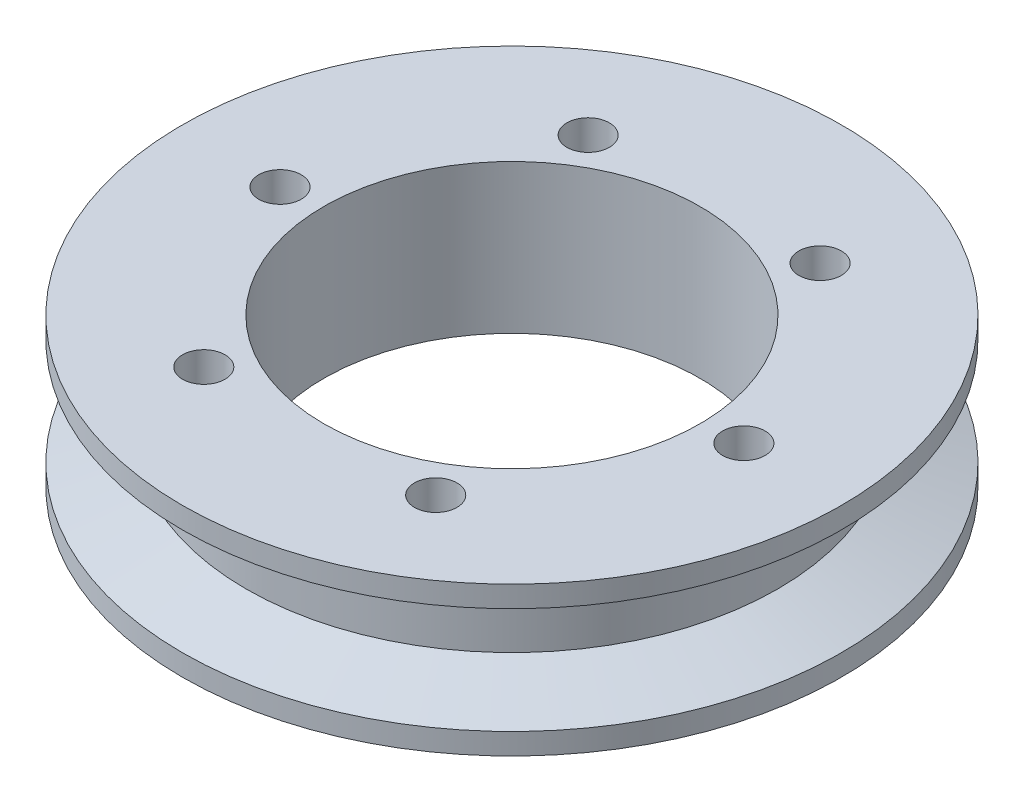
ISO-10303-21;
HEADER;
FILE_DESCRIPTION(('STEP AP214'),'2;1');
FILE_NAME('part.step','',(''),(''),'','','');
FILE_SCHEMA(('AUTOMOTIVE_DESIGN { 1 0 10303 214 1 1 1 1 }'));
ENDSEC;
DATA;
#1=APPLICATION_CONTEXT('core data for automotive mechanical design processes');
#2=APPLICATION_PROTOCOL_DEFINITION('international standard','automotive_design',2000,#1);
#3=PRODUCT_CONTEXT('',#1,'mechanical');
#4=PRODUCT('Part','Part','',(#3));
#5=PRODUCT_RELATED_PRODUCT_CATEGORY('part','',(#4));
#6=PRODUCT_DEFINITION_FORMATION('','',#4);
#7=PRODUCT_DEFINITION_CONTEXT('part definition',#1,'design');
#8=PRODUCT_DEFINITION('design','',#6,#7);
#9=PRODUCT_DEFINITION_SHAPE('','',#8);
#10=(LENGTH_UNIT() NAMED_UNIT(*) SI_UNIT(.MILLI.,.METRE.));
#11=(NAMED_UNIT(*) PLANE_ANGLE_UNIT() SI_UNIT($,.RADIAN.));
#12=(NAMED_UNIT(*) SI_UNIT($,.STERADIAN.) SOLID_ANGLE_UNIT());
#13=UNCERTAINTY_MEASURE_WITH_UNIT(LENGTH_MEASURE(1.E-05),#10,'distance_accuracy_value','');
#14=(GEOMETRIC_REPRESENTATION_CONTEXT(3) GLOBAL_UNCERTAINTY_ASSIGNED_CONTEXT((#13)) GLOBAL_UNIT_ASSIGNED_CONTEXT((#10,
#11,#12)) REPRESENTATION_CONTEXT('',''));
#15=CARTESIAN_POINT('',(0.,0.,0.));
#16=DIRECTION('',(0.,0.,1.));
#17=DIRECTION('',(1.,0.,0.));
#18=AXIS2_PLACEMENT_3D('',#15,#16,#17);
#19=CARTESIAN_POINT('',(-31.,8.17568952858191,0.));
#20=DIRECTION('',(0.,1.,0.));
#21=DIRECTION('',(0.,0.,1.));
#22=AXIS2_PLACEMENT_3D('',#19,#20,#21);
#23=PLANE('',#22);
#24=CARTESIAN_POINT('',(21.3447817359065,8.17568952858191,-0.472009159350846));
#25=DIRECTION('',(0.,1.,0.));
#26=DIRECTION('',(0.,0.,1.));
#27=AXIS2_PLACEMENT_3D('',#24,#25,#26);
#28=CIRCLE('',#27,2.);
#29=CARTESIAN_POINT('',(21.3447817359065,8.17568952858191,1.52799084064916));
#30=VERTEX_POINT('',#29);
#31=EDGE_CURVE('E93',#30,#30,#28,.T.);
#32=ORIENTED_EDGE('',*,*,#31,.F.);
#33=EDGE_LOOP('',(#32));
#34=FACE_BOUND('',#33,.T.);
#35=CARTESIAN_POINT('',(10.2636189451365,8.17568952858191,-18.7211278012046));
#36=DIRECTION('',(0.,1.,0.));
#37=DIRECTION('',(0.,0.,1.));
#38=AXIS2_PLACEMENT_3D('',#35,#36,#37);
#39=CIRCLE('',#38,2.);
#40=CARTESIAN_POINT('',(10.2636189451365,8.17568952858191,-16.7211278012046));
#41=VERTEX_POINT('',#40);
#42=EDGE_CURVE('E101',#41,#41,#39,.T.);
#43=ORIENTED_EDGE('',*,*,#42,.F.);
#44=EDGE_LOOP('',(#43));
#45=FACE_BOUND('',#44,.T.);
#46=CARTESIAN_POINT('',(-11.0811627907701,8.17568952858191,-18.2491186418537));
#47=DIRECTION('',(0.,1.,0.));
#48=DIRECTION('',(0.,0.,1.));
#49=AXIS2_PLACEMENT_3D('',#46,#47,#48);
#50=CIRCLE('',#49,2.);
#51=CARTESIAN_POINT('',(-11.0811627907701,8.17568952858191,-16.2491186418537));
#52=VERTEX_POINT('',#51);
#53=EDGE_CURVE('E109',#52,#52,#50,.T.);
#54=ORIENTED_EDGE('',*,*,#53,.F.);
#55=EDGE_LOOP('',(#54));
#56=FACE_BOUND('',#55,.T.);
#57=CARTESIAN_POINT('',(-21.3447817359065,8.17568952858191,0.472009159350997));
#58=DIRECTION('',(0.,1.,0.));
#59=DIRECTION('',(0.,0.,1.));
#60=AXIS2_PLACEMENT_3D('',#57,#58,#59);
#61=CIRCLE('',#60,2.);
#62=CARTESIAN_POINT('',(-21.3447817359065,8.17568952858191,2.472009159351));
#63=VERTEX_POINT('',#62);
#64=EDGE_CURVE('E117',#63,#63,#61,.T.);
#65=ORIENTED_EDGE('',*,*,#64,.F.);
#66=EDGE_LOOP('',(#65));
#67=FACE_BOUND('',#66,.T.);
#68=CARTESIAN_POINT('',(-10.2636189451363,8.17568952858191,18.7211278012047));
#69=DIRECTION('',(0.,1.,0.));
#70=DIRECTION('',(0.,0.,1.));
#71=AXIS2_PLACEMENT_3D('',#68,#69,#70);
#72=CIRCLE('',#71,2.);
#73=CARTESIAN_POINT('',(-10.2636189451363,8.17568952858191,20.7211278012047));
#74=VERTEX_POINT('',#73);
#75=EDGE_CURVE('E85',#74,#74,#72,.T.);
#76=ORIENTED_EDGE('',*,*,#75,.F.);
#77=EDGE_LOOP('',(#76));
#78=FACE_BOUND('',#77,.T.);
#79=CARTESIAN_POINT('',(11.0811627907702,8.17568952858191,18.2491186418536));
#80=DIRECTION('',(0.,1.,0.));
#81=DIRECTION('',(0.,0.,1.));
#82=AXIS2_PLACEMENT_3D('',#79,#80,#81);
#83=CIRCLE('',#82,2.);
#84=CARTESIAN_POINT('',(11.0811627907702,8.17568952858191,20.2491186418536));
#85=VERTEX_POINT('',#84);
#86=EDGE_CURVE('E81',#85,#85,#83,.T.);
#87=ORIENTED_EDGE('',*,*,#86,.F.);
#88=EDGE_LOOP('',(#87));
#89=FACE_BOUND('',#88,.T.);
#90=CARTESIAN_POINT('',(0.,8.17568952858191,0.));
#91=DIRECTION('',(0.,1.,0.));
#92=DIRECTION('',(0.,0.,1.));
#93=AXIS2_PLACEMENT_3D('',#90,#91,#92);
#94=CIRCLE('',#93,31.);
#95=CARTESIAN_POINT('',(0.,8.17568952858191,31.));
#96=VERTEX_POINT('',#95);
#97=EDGE_CURVE('E76',#96,#96,#94,.T.);
#98=ORIENTED_EDGE('',*,*,#97,.T.);
#99=EDGE_LOOP('',(#98));
#100=FACE_BOUND('',#99,.T.);
#101=CARTESIAN_POINT('',(0.,8.17568952858191,0.));
#102=DIRECTION('',(0.,1.,0.));
#103=DIRECTION('',(0.,0.,1.));
#104=AXIS2_PLACEMENT_3D('',#101,#102,#103);
#105=CIRCLE('',#104,17.7);
#106=CARTESIAN_POINT('',(0.,8.17568952858191,17.7));
#107=VERTEX_POINT('',#106);
#108=EDGE_CURVE('E10',#107,#107,#105,.T.);
#109=ORIENTED_EDGE('',*,*,#108,.F.);
#110=EDGE_LOOP('',(#109));
#111=FACE_BOUND('',#110,.T.);
#112=ADVANCED_FACE('F41',(#34,#45,#56,#67,#78,#89,#100,#111),#23,.T.);
#113=CARTESIAN_POINT('',(0.,20.7329629908994,0.));
#114=DIRECTION('',(0.,1.,0.));
#115=DIRECTION('',(0.,0.,1.));
#116=AXIS2_PLACEMENT_3D('',#113,#114,#115);
#117=CYLINDRICAL_SURFACE('',#116,17.7);
#118=ORIENTED_EDGE('',*,*,#108,.T.);
#119=EDGE_LOOP('',(#118));
#120=FACE_BOUND('',#119,.T.);
#121=CARTESIAN_POINT('',(0.,-5.82431047141809,0.));
#122=DIRECTION('',(0.,1.,0.));
#123=DIRECTION('',(0.,0.,1.));
#124=AXIS2_PLACEMENT_3D('',#121,#122,#123);
#125=CIRCLE('',#124,17.7);
#126=CARTESIAN_POINT('',(0.,-5.82431047141809,17.7));
#127=VERTEX_POINT('',#126);
#128=EDGE_CURVE('E48',#127,#127,#125,.T.);
#129=ORIENTED_EDGE('',*,*,#128,.F.);
#130=EDGE_LOOP('',(#129));
#131=FACE_BOUND('',#130,.T.);
#132=ADVANCED_FACE('F133',(#120,#131),#117,.F.);
#133=CARTESIAN_POINT('',(-17.7,-5.82431047141809,0.));
#134=DIRECTION('',(0.,-1.,0.));
#135=DIRECTION('',(0.,0.,-1.));
#136=AXIS2_PLACEMENT_3D('',#133,#134,#135);
#137=PLANE('',#136);
#138=CARTESIAN_POINT('',(21.3447817359065,-5.82431047141809,-0.472009159350846));
#139=DIRECTION('',(0.,1.,0.));
#140=DIRECTION('',(0.,0.,1.));
#141=AXIS2_PLACEMENT_3D('',#138,#139,#140);
#142=CIRCLE('',#141,2.);
#143=CARTESIAN_POINT('',(21.3447817359065,-5.82431047141809,1.52799084064916));
#144=VERTEX_POINT('',#143);
#145=EDGE_CURVE('E89',#144,#144,#142,.T.);
#146=ORIENTED_EDGE('',*,*,#145,.T.);
#147=EDGE_LOOP('',(#146));
#148=FACE_BOUND('',#147,.T.);
#149=CARTESIAN_POINT('',(10.2636189451365,-5.82431047141809,-18.7211278012046));
#150=DIRECTION('',(0.,1.,0.));
#151=DIRECTION('',(0.,0.,1.));
#152=AXIS2_PLACEMENT_3D('',#149,#150,#151);
#153=CIRCLE('',#152,2.);
#154=CARTESIAN_POINT('',(10.2636189451365,-5.82431047141809,-16.7211278012046));
#155=VERTEX_POINT('',#154);
#156=EDGE_CURVE('E97',#155,#155,#153,.T.);
#157=ORIENTED_EDGE('',*,*,#156,.T.);
#158=EDGE_LOOP('',(#157));
#159=FACE_BOUND('',#158,.T.);
#160=CARTESIAN_POINT('',(-11.0811627907701,-5.82431047141809,-18.2491186418537));
#161=DIRECTION('',(0.,1.,0.));
#162=DIRECTION('',(0.,0.,1.));
#163=AXIS2_PLACEMENT_3D('',#160,#161,#162);
#164=CIRCLE('',#163,2.);
#165=CARTESIAN_POINT('',(-11.0811627907701,-5.82431047141809,-16.2491186418537));
#166=VERTEX_POINT('',#165);
#167=EDGE_CURVE('E105',#166,#166,#164,.T.);
#168=ORIENTED_EDGE('',*,*,#167,.T.);
#169=EDGE_LOOP('',(#168));
#170=FACE_BOUND('',#169,.T.);
#171=CARTESIAN_POINT('',(-21.3447817359065,-5.82431047141809,0.472009159350997));
#172=DIRECTION('',(0.,1.,0.));
#173=DIRECTION('',(0.,0.,1.));
#174=AXIS2_PLACEMENT_3D('',#171,#172,#173);
#175=CIRCLE('',#174,2.);
#176=CARTESIAN_POINT('',(-21.3447817359065,-5.82431047141809,2.472009159351));
#177=VERTEX_POINT('',#176);
#178=EDGE_CURVE('E113',#177,#177,#175,.T.);
#179=ORIENTED_EDGE('',*,*,#178,.T.);
#180=EDGE_LOOP('',(#179));
#181=FACE_BOUND('',#180,.T.);
#182=CARTESIAN_POINT('',(-10.2636189451363,-5.82431047141809,18.7211278012047));
#183=DIRECTION('',(0.,1.,0.));
#184=DIRECTION('',(0.,0.,1.));
#185=AXIS2_PLACEMENT_3D('',#182,#183,#184);
#186=CIRCLE('',#185,2.);
#187=CARTESIAN_POINT('',(-10.2636189451363,-5.82431047141809,20.7211278012047));
#188=VERTEX_POINT('',#187);
#189=EDGE_CURVE('E121',#188,#188,#186,.T.);
#190=ORIENTED_EDGE('',*,*,#189,.T.);
#191=EDGE_LOOP('',(#190));
#192=FACE_BOUND('',#191,.T.);
#193=CARTESIAN_POINT('',(11.0811627907702,-5.82431047141809,18.2491186418536));
#194=DIRECTION('',(0.,1.,0.));
#195=DIRECTION('',(0.,0.,1.));
#196=AXIS2_PLACEMENT_3D('',#193,#194,#195);
#197=CIRCLE('',#196,2.);
#198=CARTESIAN_POINT('',(11.0811627907702,-5.82431047141809,20.2491186418536));
#199=VERTEX_POINT('',#198);
#200=EDGE_CURVE('E80',#199,#199,#197,.T.);
#201=ORIENTED_EDGE('',*,*,#200,.T.);
#202=EDGE_LOOP('',(#201));
#203=FACE_BOUND('',#202,.T.);
#204=ORIENTED_EDGE('',*,*,#128,.T.);
#205=EDGE_LOOP('',(#204));
#206=FACE_BOUND('',#205,.T.);
#207=CARTESIAN_POINT('',(0.,-5.82431047141809,0.));
#208=DIRECTION('',(0.,1.,0.));
#209=DIRECTION('',(0.,0.,1.));
#210=AXIS2_PLACEMENT_3D('',#207,#208,#209);
#211=CIRCLE('',#210,31.);
#212=CARTESIAN_POINT('',(0.,-5.82431047141809,31.));
#213=VERTEX_POINT('',#212);
#214=EDGE_CURVE('E53',#213,#213,#211,.T.);
#215=ORIENTED_EDGE('',*,*,#214,.F.);
#216=EDGE_LOOP('',(#215));
#217=FACE_BOUND('',#216,.T.);
#218=ADVANCED_FACE('F167',(#148,#159,#170,#181,#192,#203,#206,#217),#137,.T.);
#219=CARTESIAN_POINT('',(0.,20.7329629908994,0.));
#220=DIRECTION('',(0.,1.,0.));
#221=DIRECTION('',(0.,0.,1.));
#222=AXIS2_PLACEMENT_3D('',#219,#220,#221);
#223=CYLINDRICAL_SURFACE('',#222,31.);
#224=ORIENTED_EDGE('',*,*,#214,.T.);
#225=EDGE_LOOP('',(#224));
#226=FACE_BOUND('',#225,.T.);
#227=CARTESIAN_POINT('',(0.,-3.82431047141809,0.));
#228=DIRECTION('',(0.,1.,0.));
#229=DIRECTION('',(0.,0.,1.));
#230=AXIS2_PLACEMENT_3D('',#227,#228,#229);
#231=CIRCLE('',#230,31.);
#232=CARTESIAN_POINT('',(0.,-3.82431047141809,31.));
#233=VERTEX_POINT('',#232);
#234=EDGE_CURVE('E58',#233,#233,#231,.T.);
#235=ORIENTED_EDGE('',*,*,#234,.F.);
#236=EDGE_LOOP('',(#235));
#237=FACE_BOUND('',#236,.T.);
#238=ADVANCED_FACE('F163',(#226,#237),#223,.T.);
#239=CARTESIAN_POINT('',(0.,-1.63931047141809,0.));
#240=DIRECTION('',(0.,-1.,0.));
#241=DIRECTION('',(0.,0.,-1.));
#242=AXIS2_PLACEMENT_3D('',#239,#240,#241);
#243=CONICAL_SURFACE('',#242,25.,1.22155703317297);
#244=ORIENTED_EDGE('',*,*,#234,.T.);
#245=EDGE_LOOP('',(#244));
#246=FACE_BOUND('',#245,.T.);
#247=CARTESIAN_POINT('',(0.,-1.63931047141809,0.));
#248=DIRECTION('',(0.,1.,0.));
#249=DIRECTION('',(0.,0.,1.));
#250=AXIS2_PLACEMENT_3D('',#247,#248,#249);
#251=CIRCLE('',#250,25.);
#252=CARTESIAN_POINT('',(0.,-1.63931047141809,25.));
#253=VERTEX_POINT('',#252);
#254=EDGE_CURVE('E64',#253,#253,#251,.T.);
#255=ORIENTED_EDGE('',*,*,#254,.F.);
#256=EDGE_LOOP('',(#255));
#257=FACE_BOUND('',#256,.T.);
#258=ADVANCED_FACE('F159',(#246,#257),#243,.T.);
#259=CARTESIAN_POINT('',(0.,20.7329629908994,0.));
#260=DIRECTION('',(0.,1.,0.));
#261=DIRECTION('',(0.,0.,1.));
#262=AXIS2_PLACEMENT_3D('',#259,#260,#261);
#263=CYLINDRICAL_SURFACE('',#262,25.);
#264=ORIENTED_EDGE('',*,*,#254,.T.);
#265=EDGE_LOOP('',(#264));
#266=FACE_BOUND('',#265,.T.);
#267=CARTESIAN_POINT('',(0.,3.99068952858191,0.));
#268=DIRECTION('',(0.,1.,0.));
#269=DIRECTION('',(0.,0.,1.));
#270=AXIS2_PLACEMENT_3D('',#267,#268,#269);
#271=CIRCLE('',#270,25.);
#272=CARTESIAN_POINT('',(0.,3.99068952858191,25.));
#273=VERTEX_POINT('',#272);
#274=EDGE_CURVE('E68',#273,#273,#271,.T.);
#275=ORIENTED_EDGE('',*,*,#274,.F.);
#276=EDGE_LOOP('',(#275));
#277=FACE_BOUND('',#276,.T.);
#278=ADVANCED_FACE('F152',(#266,#277),#263,.T.);
#279=CARTESIAN_POINT('',(0.,6.17568952858191,0.));
#280=DIRECTION('',(0.,1.,0.));
#281=DIRECTION('',(0.,0.,1.));
#282=AXIS2_PLACEMENT_3D('',#279,#280,#281);
#283=CONICAL_SURFACE('',#282,31.,1.22155703317297);
#284=ORIENTED_EDGE('',*,*,#274,.T.);
#285=EDGE_LOOP('',(#284));
#286=FACE_BOUND('',#285,.T.);
#287=CARTESIAN_POINT('',(0.,6.17568952858191,0.));
#288=DIRECTION('',(0.,1.,0.));
#289=DIRECTION('',(0.,0.,1.));
#290=AXIS2_PLACEMENT_3D('',#287,#288,#289);
#291=CIRCLE('',#290,31.);
#292=CARTESIAN_POINT('',(0.,6.17568952858191,31.));
#293=VERTEX_POINT('',#292);
#294=EDGE_CURVE('E72',#293,#293,#291,.T.);
#295=ORIENTED_EDGE('',*,*,#294,.F.);
#296=EDGE_LOOP('',(#295));
#297=FACE_BOUND('',#296,.T.);
#298=ADVANCED_FACE('F143',(#286,#297),#283,.T.);
#299=CARTESIAN_POINT('',(0.,20.7329629908994,0.));
#300=DIRECTION('',(0.,1.,0.));
#301=DIRECTION('',(0.,0.,1.));
#302=AXIS2_PLACEMENT_3D('',#299,#300,#301);
#303=CYLINDRICAL_SURFACE('',#302,31.);
#304=ORIENTED_EDGE('',*,*,#294,.T.);
#305=EDGE_LOOP('',(#304));
#306=FACE_BOUND('',#305,.T.);
#307=ORIENTED_EDGE('',*,*,#97,.F.);
#308=EDGE_LOOP('',(#307));
#309=FACE_BOUND('',#308,.T.);
#310=ADVANCED_FACE('F140',(#306,#309),#303,.T.);
#311=CARTESIAN_POINT('',(11.0811627907702,-5.82431047141809,18.2491186418536));
#312=DIRECTION('',(0.,1.,0.));
#313=DIRECTION('',(0.,0.,1.));
#314=AXIS2_PLACEMENT_3D('',#311,#312,#313);
#315=CYLINDRICAL_SURFACE('',#314,2.);
#316=ORIENTED_EDGE('',*,*,#200,.F.);
#317=EDGE_LOOP('',(#316));
#318=FACE_BOUND('',#317,.T.);
#319=ORIENTED_EDGE('',*,*,#86,.T.);
#320=EDGE_LOOP('',(#319));
#321=FACE_BOUND('',#320,.T.);
#322=ADVANCED_FACE('F142',(#318,#321),#315,.F.);
#323=CARTESIAN_POINT('',(-10.2636189451363,-5.82431047141809,18.7211278012047));
#324=DIRECTION('',(0.,1.,0.));
#325=DIRECTION('',(0.,0.,1.));
#326=AXIS2_PLACEMENT_3D('',#323,#324,#325);
#327=CYLINDRICAL_SURFACE('',#326,2.);
#328=ORIENTED_EDGE('',*,*,#189,.F.);
#329=EDGE_LOOP('',(#328));
#330=FACE_BOUND('',#329,.T.);
#331=ORIENTED_EDGE('',*,*,#75,.T.);
#332=EDGE_LOOP('',(#331));
#333=FACE_BOUND('',#332,.T.);
#334=ADVANCED_FACE('F129',(#330,#333),#327,.F.);
#335=CARTESIAN_POINT('',(-21.3447817359065,-5.82431047141809,0.472009159350997));
#336=DIRECTION('',(0.,1.,0.));
#337=DIRECTION('',(0.,0.,1.));
#338=AXIS2_PLACEMENT_3D('',#335,#336,#337);
#339=CYLINDRICAL_SURFACE('',#338,2.);
#340=ORIENTED_EDGE('',*,*,#178,.F.);
#341=EDGE_LOOP('',(#340));
#342=FACE_BOUND('',#341,.T.);
#343=ORIENTED_EDGE('',*,*,#64,.T.);
#344=EDGE_LOOP('',(#343));
#345=FACE_BOUND('',#344,.T.);
#346=ADVANCED_FACE('F246',(#342,#345),#339,.F.);
#347=CARTESIAN_POINT('',(-11.0811627907701,-5.82431047141809,-18.2491186418537));
#348=DIRECTION('',(0.,1.,0.));
#349=DIRECTION('',(0.,0.,1.));
#350=AXIS2_PLACEMENT_3D('',#347,#348,#349);
#351=CYLINDRICAL_SURFACE('',#350,2.);
#352=ORIENTED_EDGE('',*,*,#167,.F.);
#353=EDGE_LOOP('',(#352));
#354=FACE_BOUND('',#353,.T.);
#355=ORIENTED_EDGE('',*,*,#53,.T.);
#356=EDGE_LOOP('',(#355));
#357=FACE_BOUND('',#356,.T.);
#358=ADVANCED_FACE('F256',(#354,#357),#351,.F.);
#359=CARTESIAN_POINT('',(10.2636189451365,-5.82431047141809,-18.7211278012046));
#360=DIRECTION('',(0.,1.,0.));
#361=DIRECTION('',(0.,0.,1.));
#362=AXIS2_PLACEMENT_3D('',#359,#360,#361);
#363=CYLINDRICAL_SURFACE('',#362,2.);
#364=ORIENTED_EDGE('',*,*,#156,.F.);
#365=EDGE_LOOP('',(#364));
#366=FACE_BOUND('',#365,.T.);
#367=ORIENTED_EDGE('',*,*,#42,.T.);
#368=EDGE_LOOP('',(#367));
#369=FACE_BOUND('',#368,.T.);
#370=ADVANCED_FACE('F266',(#366,#369),#363,.F.);
#371=CARTESIAN_POINT('',(21.3447817359065,-5.82431047141809,-0.472009159350846));
#372=DIRECTION('',(0.,1.,0.));
#373=DIRECTION('',(0.,0.,1.));
#374=AXIS2_PLACEMENT_3D('',#371,#372,#373);
#375=CYLINDRICAL_SURFACE('',#374,2.);
#376=ORIENTED_EDGE('',*,*,#145,.F.);
#377=EDGE_LOOP('',(#376));
#378=FACE_BOUND('',#377,.T.);
#379=ORIENTED_EDGE('',*,*,#31,.T.);
#380=EDGE_LOOP('',(#379));
#381=FACE_BOUND('',#380,.T.);
#382=ADVANCED_FACE('F276',(#378,#381),#375,.F.);
#383=CLOSED_SHELL('',(#112,#132,#218,#238,#258,#278,#298,#310,#322,#334,#346,#358,#370,#382));
#384=MANIFOLD_SOLID_BREP('B2',#383);
#385=ADVANCED_BREP_SHAPE_REPRESENTATION('',(#18,#384),#14);
#386=SHAPE_DEFINITION_REPRESENTATION(#9,#385);
ENDSEC;
END-ISO-10303-21;
